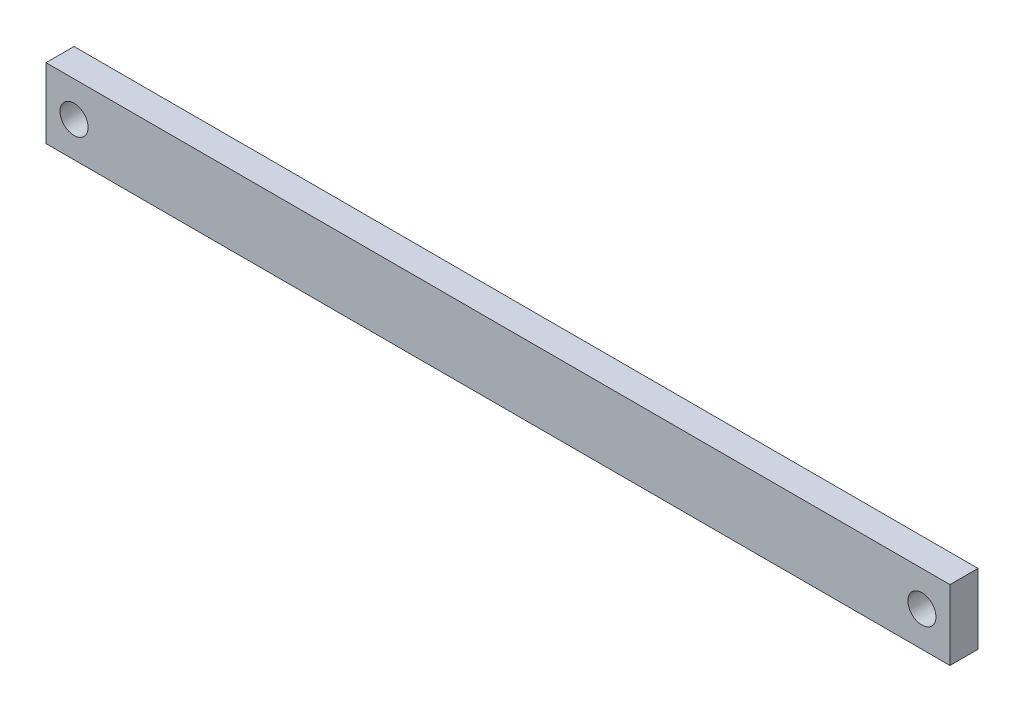
ISO-10303-21;
HEADER;
FILE_DESCRIPTION(('STEP AP214'),'2;1');
FILE_NAME('part.step','',(''),(''),'','','');
FILE_SCHEMA(('AUTOMOTIVE_DESIGN { 1 0 10303 214 1 1 1 1 }'));
ENDSEC;
DATA;
#1=APPLICATION_CONTEXT('core data for automotive mechanical design processes');
#2=APPLICATION_PROTOCOL_DEFINITION('international standard','automotive_design',2000,#1);
#3=PRODUCT_CONTEXT('',#1,'mechanical');
#4=PRODUCT('Part','Part','',(#3));
#5=PRODUCT_RELATED_PRODUCT_CATEGORY('part','',(#4));
#6=PRODUCT_DEFINITION_FORMATION('','',#4);
#7=PRODUCT_DEFINITION_CONTEXT('part definition',#1,'design');
#8=PRODUCT_DEFINITION('design','',#6,#7);
#9=PRODUCT_DEFINITION_SHAPE('','',#8);
#10=(LENGTH_UNIT() NAMED_UNIT(*) SI_UNIT(.MILLI.,.METRE.));
#11=(NAMED_UNIT(*) PLANE_ANGLE_UNIT() SI_UNIT($,.RADIAN.));
#12=(NAMED_UNIT(*) SI_UNIT($,.STERADIAN.) SOLID_ANGLE_UNIT());
#13=UNCERTAINTY_MEASURE_WITH_UNIT(LENGTH_MEASURE(1.E-05),#10,'distance_accuracy_value','');
#14=(GEOMETRIC_REPRESENTATION_CONTEXT(3) GLOBAL_UNCERTAINTY_ASSIGNED_CONTEXT((#13)) GLOBAL_UNIT_ASSIGNED_CONTEXT((#10,
#11,#12)) REPRESENTATION_CONTEXT('',''));
#15=CARTESIAN_POINT('',(0.,0.,0.));
#16=DIRECTION('',(0.,0.,1.));
#17=DIRECTION('',(1.,0.,0.));
#18=AXIS2_PLACEMENT_3D('',#15,#16,#17);
#19=CARTESIAN_POINT('',(-327.56856,-25.4,11.43));
#20=DIRECTION('',(1.,0.,0.));
#21=DIRECTION('',(0.,0.,-1.));
#22=AXIS2_PLACEMENT_3D('',#19,#20,#21);
#23=PLANE('',#22);
#24=DIRECTION('',(0.,-1.,0.));
#25=VECTOR('',#24,1.);
#26=CARTESIAN_POINT('',(-327.56856,-25.4,-8.89));
#27=LINE('',#26,#25);
#28=CARTESIAN_POINT('',(-327.56856,25.4,-8.89));
#29=VERTEX_POINT('',#28);
#30=CARTESIAN_POINT('',(-327.56856,-25.4,-8.89));
#31=VERTEX_POINT('',#30);
#32=EDGE_CURVE('E113',#29,#31,#27,.T.);
#33=ORIENTED_EDGE('',*,*,#32,.T.);
#34=DIRECTION('',(0.,0.,-1.));
#35=VECTOR('',#34,1.);
#36=CARTESIAN_POINT('',(-327.56856,-25.4,11.43));
#37=LINE('',#36,#35);
#38=CARTESIAN_POINT('',(-327.56856,-25.4,11.43));
#39=VERTEX_POINT('',#38);
#40=EDGE_CURVE('E12',#39,#31,#37,.T.);
#41=ORIENTED_EDGE('',*,*,#40,.F.);
#42=DIRECTION('',(0.,-1.,0.));
#43=VECTOR('',#42,1.);
#44=CARTESIAN_POINT('',(-327.56856,-25.4,11.43));
#45=LINE('',#44,#43);
#46=CARTESIAN_POINT('',(-327.56856,25.4,11.43));
#47=VERTEX_POINT('',#46);
#48=EDGE_CURVE('E97',#47,#39,#45,.T.);
#49=ORIENTED_EDGE('',*,*,#48,.F.);
#50=DIRECTION('',(0.,0.,-1.));
#51=VECTOR('',#50,1.);
#52=CARTESIAN_POINT('',(-327.56856,25.4,11.43));
#53=LINE('',#52,#51);
#54=EDGE_CURVE('E109',#47,#29,#53,.T.);
#55=ORIENTED_EDGE('',*,*,#54,.T.);
#56=EDGE_LOOP('',(#33,#41,#49,#55));
#57=FACE_BOUND('',#56,.T.);
#58=ADVANCED_FACE('F45',(#57),#23,.F.);
#59=CARTESIAN_POINT('',(-327.56856,-25.4,11.43));
#60=DIRECTION('',(0.,1.,0.));
#61=DIRECTION('',(0.,0.,1.));
#62=AXIS2_PLACEMENT_3D('',#59,#60,#61);
#63=PLANE('',#62);
#64=DIRECTION('',(1.,0.,0.));
#65=VECTOR('',#64,1.);
#66=CARTESIAN_POINT('',(-327.56856,-25.4,-8.89));
#67=LINE('',#66,#65);
#68=CARTESIAN_POINT('',(327.56856,-25.4,-8.89));
#69=VERTEX_POINT('',#68);
#70=EDGE_CURVE('E102',#31,#69,#67,.T.);
#71=ORIENTED_EDGE('',*,*,#70,.T.);
#72=DIRECTION('',(0.,0.,-1.));
#73=VECTOR('',#72,1.);
#74=CARTESIAN_POINT('',(327.56856,-25.4,11.43));
#75=LINE('',#74,#73);
#76=CARTESIAN_POINT('',(327.56856,-25.4,11.43));
#77=VERTEX_POINT('',#76);
#78=EDGE_CURVE('E54',#77,#69,#75,.T.);
#79=ORIENTED_EDGE('',*,*,#78,.F.);
#80=DIRECTION('',(1.,0.,0.));
#81=VECTOR('',#80,1.);
#82=CARTESIAN_POINT('',(-327.56856,-25.4,11.43));
#83=LINE('',#82,#81);
#84=EDGE_CURVE('E92',#39,#77,#83,.T.);
#85=ORIENTED_EDGE('',*,*,#84,.F.);
#86=ORIENTED_EDGE('',*,*,#40,.T.);
#87=EDGE_LOOP('',(#71,#79,#85,#86));
#88=FACE_BOUND('',#87,.T.);
#89=ADVANCED_FACE('F101',(#88),#63,.F.);
#90=CARTESIAN_POINT('',(327.56856,-25.4,11.43));
#91=DIRECTION('',(-1.,0.,0.));
#92=DIRECTION('',(0.,0.,1.));
#93=AXIS2_PLACEMENT_3D('',#90,#91,#92);
#94=PLANE('',#93);
#95=DIRECTION('',(0.,1.,0.));
#96=VECTOR('',#95,1.);
#97=CARTESIAN_POINT('',(327.56856,-25.4,-8.89));
#98=LINE('',#97,#96);
#99=CARTESIAN_POINT('',(327.56856,25.4,-8.89));
#100=VERTEX_POINT('',#99);
#101=EDGE_CURVE('E79',#69,#100,#98,.T.);
#102=ORIENTED_EDGE('',*,*,#101,.T.);
#103=DIRECTION('',(0.,0.,-1.));
#104=VECTOR('',#103,1.);
#105=CARTESIAN_POINT('',(327.56856,25.4,11.43));
#106=LINE('',#105,#104);
#107=CARTESIAN_POINT('',(327.56856,25.4,11.43));
#108=VERTEX_POINT('',#107);
#109=EDGE_CURVE('E104',#108,#100,#106,.T.);
#110=ORIENTED_EDGE('',*,*,#109,.F.);
#111=DIRECTION('',(0.,1.,0.));
#112=VECTOR('',#111,1.);
#113=CARTESIAN_POINT('',(327.56856,-25.4,11.43));
#114=LINE('',#113,#112);
#115=EDGE_CURVE('E95',#77,#108,#114,.T.);
#116=ORIENTED_EDGE('',*,*,#115,.F.);
#117=ORIENTED_EDGE('',*,*,#78,.T.);
#118=EDGE_LOOP('',(#102,#110,#116,#117));
#119=FACE_BOUND('',#118,.T.);
#120=ADVANCED_FACE('F105',(#119),#94,.F.);
#121=CARTESIAN_POINT('',(-327.56856,25.4,11.43));
#122=DIRECTION('',(0.,-1.,0.));
#123=DIRECTION('',(0.,0.,-1.));
#124=AXIS2_PLACEMENT_3D('',#121,#122,#123);
#125=PLANE('',#124);
#126=DIRECTION('',(-1.,0.,0.));
#127=VECTOR('',#126,1.);
#128=CARTESIAN_POINT('',(-327.56856,25.4,-8.89));
#129=LINE('',#128,#127);
#130=EDGE_CURVE('E85',#100,#29,#129,.T.);
#131=ORIENTED_EDGE('',*,*,#130,.T.);
#132=ORIENTED_EDGE('',*,*,#54,.F.);
#133=DIRECTION('',(-1.,0.,0.));
#134=VECTOR('',#133,1.);
#135=CARTESIAN_POINT('',(-327.56856,25.4,11.43));
#136=LINE('',#135,#134);
#137=EDGE_CURVE('E62',#108,#47,#136,.T.);
#138=ORIENTED_EDGE('',*,*,#137,.F.);
#139=ORIENTED_EDGE('',*,*,#109,.T.);
#140=EDGE_LOOP('',(#131,#132,#138,#139));
#141=FACE_BOUND('',#140,.T.);
#142=ADVANCED_FACE('F127',(#141),#125,.F.);
#143=CARTESIAN_POINT('',(0.,0.,11.43));
#144=DIRECTION('',(0.,0.,-1.));
#145=DIRECTION('',(-1.,0.,0.));
#146=AXIS2_PLACEMENT_3D('',#143,#144,#145);
#147=PLANE('',#146);
#148=CARTESIAN_POINT('',(307.24856,0.,11.43));
#149=DIRECTION('',(0.,0.,-1.));
#150=DIRECTION('',(-1.,0.,0.));
#151=AXIS2_PLACEMENT_3D('',#148,#149,#150);
#152=CIRCLE('',#151,10.1599999999999);
#153=CARTESIAN_POINT('',(297.08856,0.,11.43));
#154=VERTEX_POINT('',#153);
#155=EDGE_CURVE('E138',#154,#154,#152,.T.);
#156=ORIENTED_EDGE('',*,*,#155,.T.);
#157=EDGE_LOOP('',(#156));
#158=FACE_BOUND('',#157,.T.);
#159=CARTESIAN_POINT('',(-307.24856,0.,11.43));
#160=DIRECTION('',(0.,0.,1.));
#161=DIRECTION('',(1.,0.,0.));
#162=AXIS2_PLACEMENT_3D('',#159,#160,#161);
#163=CIRCLE('',#162,10.1599999999999);
#164=CARTESIAN_POINT('',(-297.08856,0.,11.43));
#165=VERTEX_POINT('',#164);
#166=EDGE_CURVE('E117',#165,#165,#163,.T.);
#167=ORIENTED_EDGE('',*,*,#166,.F.);
#168=EDGE_LOOP('',(#167));
#169=FACE_BOUND('',#168,.T.);
#170=ORIENTED_EDGE('',*,*,#48,.T.);
#171=ORIENTED_EDGE('',*,*,#84,.T.);
#172=ORIENTED_EDGE('',*,*,#115,.T.);
#173=ORIENTED_EDGE('',*,*,#137,.T.);
#174=EDGE_LOOP('',(#170,#171,#172,#173));
#175=FACE_BOUND('',#174,.T.);
#176=ADVANCED_FACE('F93',(#158,#169,#175),#147,.F.);
#177=CARTESIAN_POINT('',(0.,0.,-8.89));
#178=DIRECTION('',(0.,0.,-1.));
#179=DIRECTION('',(-1.,0.,0.));
#180=AXIS2_PLACEMENT_3D('',#177,#178,#179);
#181=PLANE('',#180);
#182=CARTESIAN_POINT('',(307.24856,0.,-8.89));
#183=DIRECTION('',(0.,0.,-1.));
#184=DIRECTION('',(-1.,0.,0.));
#185=AXIS2_PLACEMENT_3D('',#182,#183,#184);
#186=CIRCLE('',#185,10.1599999999999);
#187=CARTESIAN_POINT('',(297.08856,0.,-8.89));
#188=VERTEX_POINT('',#187);
#189=EDGE_CURVE('E142',#188,#188,#186,.T.);
#190=ORIENTED_EDGE('',*,*,#189,.F.);
#191=EDGE_LOOP('',(#190));
#192=FACE_BOUND('',#191,.T.);
#193=CARTESIAN_POINT('',(-307.24856,0.,-8.89));
#194=DIRECTION('',(0.,0.,1.));
#195=DIRECTION('',(1.,0.,0.));
#196=AXIS2_PLACEMENT_3D('',#193,#194,#195);
#197=CIRCLE('',#196,10.1599999999999);
#198=CARTESIAN_POINT('',(-297.08856,0.,-8.89));
#199=VERTEX_POINT('',#198);
#200=EDGE_CURVE('E134',#199,#199,#197,.T.);
#201=ORIENTED_EDGE('',*,*,#200,.T.);
#202=EDGE_LOOP('',(#201));
#203=FACE_BOUND('',#202,.T.);
#204=ORIENTED_EDGE('',*,*,#32,.F.);
#205=ORIENTED_EDGE('',*,*,#130,.F.);
#206=ORIENTED_EDGE('',*,*,#101,.F.);
#207=ORIENTED_EDGE('',*,*,#70,.F.);
#208=EDGE_LOOP('',(#204,#205,#206,#207));
#209=FACE_BOUND('',#208,.T.);
#210=ADVANCED_FACE('F130',(#192,#203,#209),#181,.T.);
#211=CARTESIAN_POINT('',(-307.24856,0.,11.43));
#212=DIRECTION('',(0.,0.,-1.));
#213=DIRECTION('',(-1.,0.,0.));
#214=AXIS2_PLACEMENT_3D('',#211,#212,#213);
#215=CYLINDRICAL_SURFACE('',#214,10.1599999999999);
#216=ORIENTED_EDGE('',*,*,#166,.T.);
#217=EDGE_LOOP('',(#216));
#218=FACE_BOUND('',#217,.T.);
#219=ORIENTED_EDGE('',*,*,#200,.F.);
#220=EDGE_LOOP('',(#219));
#221=FACE_BOUND('',#220,.T.);
#222=ADVANCED_FACE('F155',(#218,#221),#215,.F.);
#223=CARTESIAN_POINT('',(307.24856,0.,11.43));
#224=DIRECTION('',(0.,0.,-1.));
#225=DIRECTION('',(-1.,0.,0.));
#226=AXIS2_PLACEMENT_3D('',#223,#224,#225);
#227=CYLINDRICAL_SURFACE('',#226,10.1599999999999);
#228=ORIENTED_EDGE('',*,*,#155,.F.);
#229=EDGE_LOOP('',(#228));
#230=FACE_BOUND('',#229,.T.);
#231=ORIENTED_EDGE('',*,*,#189,.T.);
#232=EDGE_LOOP('',(#231));
#233=FACE_BOUND('',#232,.T.);
#234=ADVANCED_FACE('F152',(#230,#233),#227,.F.);
#235=CLOSED_SHELL('',(#58,#89,#120,#142,#176,#210,#222,#234));
#236=MANIFOLD_SOLID_BREP('B2',#235);
#237=ADVANCED_BREP_SHAPE_REPRESENTATION('',(#18,#236),#14);
#238=SHAPE_DEFINITION_REPRESENTATION(#9,#237);
ENDSEC;
END-ISO-10303-21;
